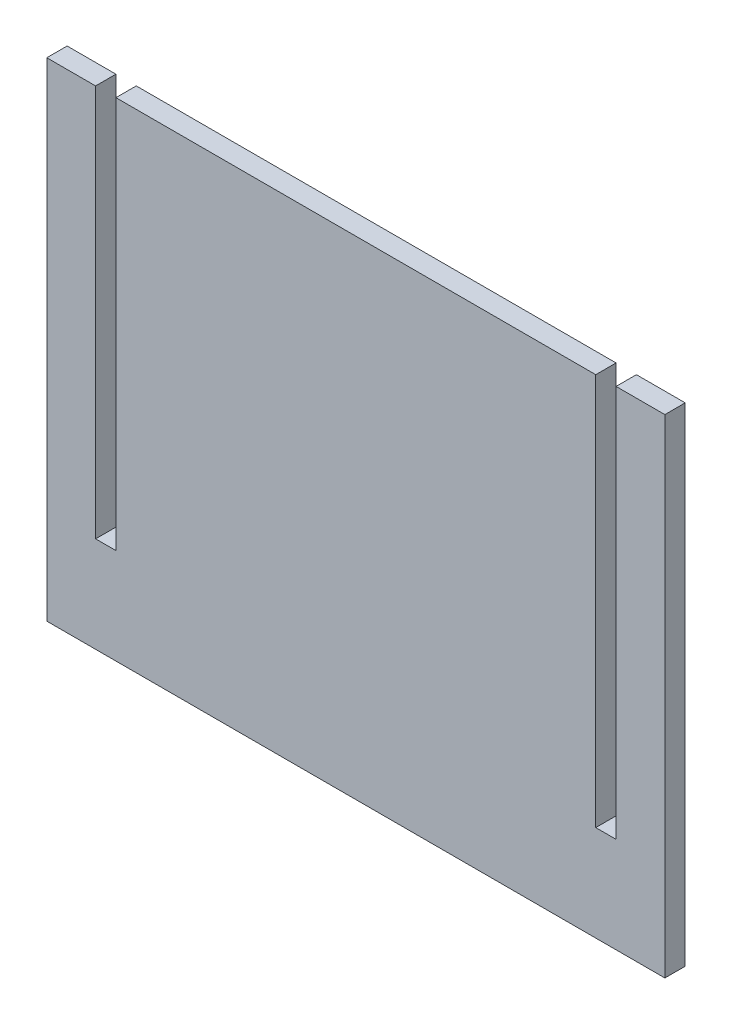
ISO-10303-21;
HEADER;
FILE_DESCRIPTION(('STEP AP214'),'2;1');
FILE_NAME('part.step','',(''),(''),'','','');
FILE_SCHEMA(('AUTOMOTIVE_DESIGN { 1 0 10303 214 1 1 1 1 }'));
ENDSEC;
DATA;
#1=APPLICATION_CONTEXT('core data for automotive mechanical design processes');
#2=APPLICATION_PROTOCOL_DEFINITION('international standard','automotive_design',2000,#1);
#3=PRODUCT_CONTEXT('',#1,'mechanical');
#4=PRODUCT('Part','Part','',(#3));
#5=PRODUCT_RELATED_PRODUCT_CATEGORY('part','',(#4));
#6=PRODUCT_DEFINITION_FORMATION('','',#4);
#7=PRODUCT_DEFINITION_CONTEXT('part definition',#1,'design');
#8=PRODUCT_DEFINITION('design','',#6,#7);
#9=PRODUCT_DEFINITION_SHAPE('','',#8);
#10=(LENGTH_UNIT() NAMED_UNIT(*) SI_UNIT(.MILLI.,.METRE.));
#11=(NAMED_UNIT(*) PLANE_ANGLE_UNIT() SI_UNIT($,.RADIAN.));
#12=(NAMED_UNIT(*) SI_UNIT($,.STERADIAN.) SOLID_ANGLE_UNIT());
#13=UNCERTAINTY_MEASURE_WITH_UNIT(LENGTH_MEASURE(1.E-05),#10,'distance_accuracy_value','');
#14=(GEOMETRIC_REPRESENTATION_CONTEXT(3) GLOBAL_UNCERTAINTY_ASSIGNED_CONTEXT((#13)) GLOBAL_UNIT_ASSIGNED_CONTEXT((#10,
#11,#12)) REPRESENTATION_CONTEXT('',''));
#15=CARTESIAN_POINT('',(0.,0.,0.));
#16=DIRECTION('',(0.,0.,1.));
#17=DIRECTION('',(1.,0.,0.));
#18=AXIS2_PLACEMENT_3D('',#15,#16,#17);
#19=CARTESIAN_POINT('',(0.,0.,3.175));
#20=DIRECTION('',(0.,1.,0.));
#21=DIRECTION('',(-1.,0.,0.));
#22=AXIS2_PLACEMENT_3D('',#19,#20,#21);
#23=PLANE('',#22);
#24=DIRECTION('',(1.,0.,0.));
#25=VECTOR('',#24,1.);
#26=CARTESIAN_POINT('',(0.,0.,0.));
#27=LINE('',#26,#25);
#28=CARTESIAN_POINT('',(0.,0.,0.));
#29=VERTEX_POINT('',#28);
#30=CARTESIAN_POINT('',(96.52,0.,0.));
#31=VERTEX_POINT('',#30);
#32=EDGE_CURVE('E209',#29,#31,#27,.T.);
#33=ORIENTED_EDGE('',*,*,#32,.T.);
#34=DIRECTION('',(0.,0.,-1.));
#35=VECTOR('',#34,1.);
#36=CARTESIAN_POINT('',(96.52,0.,3.175));
#37=LINE('',#36,#35);
#38=CARTESIAN_POINT('',(96.52,0.,3.175));
#39=VERTEX_POINT('',#38);
#40=EDGE_CURVE('E11',#39,#31,#37,.T.);
#41=ORIENTED_EDGE('',*,*,#40,.F.);
#42=DIRECTION('',(1.,0.,0.));
#43=VECTOR('',#42,1.);
#44=CARTESIAN_POINT('',(0.,0.,3.175));
#45=LINE('',#44,#43);
#46=CARTESIAN_POINT('',(0.,0.,3.175));
#47=VERTEX_POINT('',#46);
#48=EDGE_CURVE('E173',#47,#39,#45,.T.);
#49=ORIENTED_EDGE('',*,*,#48,.F.);
#50=DIRECTION('',(0.,0.,-1.));
#51=VECTOR('',#50,1.);
#52=CARTESIAN_POINT('',(0.,0.,3.175));
#53=LINE('',#52,#51);
#54=EDGE_CURVE('E51',#47,#29,#53,.T.);
#55=ORIENTED_EDGE('',*,*,#54,.T.);
#56=EDGE_LOOP('',(#33,#41,#49,#55));
#57=FACE_BOUND('',#56,.T.);
#58=ADVANCED_FACE('F35',(#57),#23,.F.);
#59=CARTESIAN_POINT('',(96.52,0.,3.175));
#60=DIRECTION('',(-1.,0.,0.));
#61=DIRECTION('',(0.,-1.,0.));
#62=AXIS2_PLACEMENT_3D('',#59,#60,#61);
#63=PLANE('',#62);
#64=DIRECTION('',(0.,1.,0.));
#65=VECTOR('',#64,1.);
#66=CARTESIAN_POINT('',(96.52,0.,0.));
#67=LINE('',#66,#65);
#68=CARTESIAN_POINT('',(96.52,76.2,0.));
#69=VERTEX_POINT('',#68);
#70=EDGE_CURVE('E207',#31,#69,#67,.T.);
#71=ORIENTED_EDGE('',*,*,#70,.T.);
#72=DIRECTION('',(0.,0.,-1.));
#73=VECTOR('',#72,1.);
#74=CARTESIAN_POINT('',(96.52,76.2,3.175));
#75=LINE('',#74,#73);
#76=CARTESIAN_POINT('',(96.52,76.2,3.175));
#77=VERTEX_POINT('',#76);
#78=EDGE_CURVE('E43',#77,#69,#75,.T.);
#79=ORIENTED_EDGE('',*,*,#78,.F.);
#80=DIRECTION('',(0.,1.,0.));
#81=VECTOR('',#80,1.);
#82=CARTESIAN_POINT('',(96.52,0.,3.175));
#83=LINE('',#82,#81);
#84=EDGE_CURVE('E101',#39,#77,#83,.T.);
#85=ORIENTED_EDGE('',*,*,#84,.F.);
#86=ORIENTED_EDGE('',*,*,#40,.T.);
#87=EDGE_LOOP('',(#71,#79,#85,#86));
#88=FACE_BOUND('',#87,.T.);
#89=ADVANCED_FACE('F208',(#88),#63,.F.);
#90=CARTESIAN_POINT('',(0.,76.2,3.175));
#91=DIRECTION('',(0.,1.,0.));
#92=DIRECTION('',(-1.,0.,0.));
#93=AXIS2_PLACEMENT_3D('',#90,#91,#92);
#94=PLANE('',#93);
#95=DIRECTION('',(1.,0.,0.));
#96=VECTOR('',#95,1.);
#97=CARTESIAN_POINT('',(0.,76.2,0.));
#98=LINE('',#97,#96);
#99=CARTESIAN_POINT('',(88.9,76.2,0.));
#100=VERTEX_POINT('',#99);
#101=EDGE_CURVE('E205',#100,#69,#98,.T.);
#102=ORIENTED_EDGE('',*,*,#101,.F.);
#103=DIRECTION('',(0.,0.,-1.));
#104=VECTOR('',#103,1.);
#105=CARTESIAN_POINT('',(88.9,76.2,3.175));
#106=LINE('',#105,#104);
#107=CARTESIAN_POINT('',(88.9,76.2,3.175));
#108=VERTEX_POINT('',#107);
#109=EDGE_CURVE('E199',#108,#100,#106,.T.);
#110=ORIENTED_EDGE('',*,*,#109,.F.);
#111=DIRECTION('',(1.,0.,0.));
#112=VECTOR('',#111,1.);
#113=CARTESIAN_POINT('',(0.,76.2,3.175));
#114=LINE('',#113,#112);
#115=EDGE_CURVE('E169',#108,#77,#114,.T.);
#116=ORIENTED_EDGE('',*,*,#115,.T.);
#117=ORIENTED_EDGE('',*,*,#78,.T.);
#118=EDGE_LOOP('',(#102,#110,#116,#117));
#119=FACE_BOUND('',#118,.T.);
#120=ADVANCED_FACE('F203',(#119),#94,.T.);
#121=CARTESIAN_POINT('',(88.9,0.,3.175));
#122=DIRECTION('',(1.,0.,0.));
#123=DIRECTION('',(0.,1.,0.));
#124=AXIS2_PLACEMENT_3D('',#121,#122,#123);
#125=PLANE('',#124);
#126=DIRECTION('',(0.,-1.,0.));
#127=VECTOR('',#126,1.);
#128=CARTESIAN_POINT('',(88.9,0.,0.));
#129=LINE('',#128,#127);
#130=CARTESIAN_POINT('',(88.9,14.9428058514673,0.));
#131=VERTEX_POINT('',#130);
#132=EDGE_CURVE('E214',#100,#131,#129,.T.);
#133=ORIENTED_EDGE('',*,*,#132,.T.);
#134=DIRECTION('',(0.,0.,-1.));
#135=VECTOR('',#134,1.);
#136=CARTESIAN_POINT('',(88.9,14.9428058514673,3.175));
#137=LINE('',#136,#135);
#138=CARTESIAN_POINT('',(88.9,14.9428058514673,3.175));
#139=VERTEX_POINT('',#138);
#140=EDGE_CURVE('E196',#139,#131,#137,.T.);
#141=ORIENTED_EDGE('',*,*,#140,.F.);
#142=DIRECTION('',(0.,-1.,0.));
#143=VECTOR('',#142,1.);
#144=CARTESIAN_POINT('',(88.9,0.,3.175));
#145=LINE('',#144,#143);
#146=EDGE_CURVE('E165',#108,#139,#145,.T.);
#147=ORIENTED_EDGE('',*,*,#146,.F.);
#148=ORIENTED_EDGE('',*,*,#109,.T.);
#149=EDGE_LOOP('',(#133,#141,#147,#148));
#150=FACE_BOUND('',#149,.T.);
#151=ADVANCED_FACE('F249',(#150),#125,.F.);
#152=CARTESIAN_POINT('',(0.,14.9428058514673,3.175));
#153=DIRECTION('',(0.,-1.,0.));
#154=DIRECTION('',(1.,0.,0.));
#155=AXIS2_PLACEMENT_3D('',#152,#153,#154);
#156=PLANE('',#155);
#157=DIRECTION('',(-1.,0.,0.));
#158=VECTOR('',#157,1.);
#159=CARTESIAN_POINT('',(0.,14.9428058514673,0.));
#160=LINE('',#159,#158);
#161=CARTESIAN_POINT('',(85.725,14.9428058514673,0.));
#162=VERTEX_POINT('',#161);
#163=EDGE_CURVE('E216',#131,#162,#160,.T.);
#164=ORIENTED_EDGE('',*,*,#163,.T.);
#165=DIRECTION('',(0.,0.,-1.));
#166=VECTOR('',#165,1.);
#167=CARTESIAN_POINT('',(85.725,14.9428058514673,3.175));
#168=LINE('',#167,#166);
#169=CARTESIAN_POINT('',(85.725,14.9428058514673,3.175));
#170=VERTEX_POINT('',#169);
#171=EDGE_CURVE('E194',#170,#162,#168,.T.);
#172=ORIENTED_EDGE('',*,*,#171,.F.);
#173=DIRECTION('',(-1.,0.,0.));
#174=VECTOR('',#173,1.);
#175=CARTESIAN_POINT('',(0.,14.9428058514673,3.175));
#176=LINE('',#175,#174);
#177=EDGE_CURVE('E162',#139,#170,#176,.T.);
#178=ORIENTED_EDGE('',*,*,#177,.F.);
#179=ORIENTED_EDGE('',*,*,#140,.T.);
#180=EDGE_LOOP('',(#164,#172,#178,#179));
#181=FACE_BOUND('',#180,.T.);
#182=ADVANCED_FACE('F245',(#181),#156,.F.);
#183=CARTESIAN_POINT('',(85.725,0.,3.175));
#184=DIRECTION('',(1.,0.,0.));
#185=DIRECTION('',(0.,1.,0.));
#186=AXIS2_PLACEMENT_3D('',#183,#184,#185);
#187=PLANE('',#186);
#188=DIRECTION('',(0.,-1.,0.));
#189=VECTOR('',#188,1.);
#190=CARTESIAN_POINT('',(85.725,0.,0.));
#191=LINE('',#190,#189);
#192=CARTESIAN_POINT('',(85.725,76.2,0.));
#193=VERTEX_POINT('',#192);
#194=EDGE_CURVE('E222',#193,#162,#191,.T.);
#195=ORIENTED_EDGE('',*,*,#194,.F.);
#196=DIRECTION('',(0.,0.,-1.));
#197=VECTOR('',#196,1.);
#198=CARTESIAN_POINT('',(85.725,76.2,3.175));
#199=LINE('',#198,#197);
#200=CARTESIAN_POINT('',(85.725,76.2,3.175));
#201=VERTEX_POINT('',#200);
#202=EDGE_CURVE('E192',#201,#193,#199,.T.);
#203=ORIENTED_EDGE('',*,*,#202,.F.);
#204=DIRECTION('',(0.,-1.,0.));
#205=VECTOR('',#204,1.);
#206=CARTESIAN_POINT('',(85.725,0.,3.175));
#207=LINE('',#206,#205);
#208=EDGE_CURVE('E158',#201,#170,#207,.T.);
#209=ORIENTED_EDGE('',*,*,#208,.T.);
#210=ORIENTED_EDGE('',*,*,#171,.T.);
#211=EDGE_LOOP('',(#195,#203,#209,#210));
#212=FACE_BOUND('',#211,.T.);
#213=ADVANCED_FACE('F241',(#212),#187,.T.);
#214=CARTESIAN_POINT('',(0.,76.2,3.175));
#215=DIRECTION('',(0.,1.,0.));
#216=DIRECTION('',(-1.,0.,0.));
#217=AXIS2_PLACEMENT_3D('',#214,#215,#216);
#218=PLANE('',#217);
#219=DIRECTION('',(1.,0.,0.));
#220=VECTOR('',#219,1.);
#221=CARTESIAN_POINT('',(0.,76.2,0.));
#222=LINE('',#221,#220);
#223=CARTESIAN_POINT('',(10.795,76.2,0.));
#224=VERTEX_POINT('',#223);
#225=EDGE_CURVE('E181',#224,#193,#222,.T.);
#226=ORIENTED_EDGE('',*,*,#225,.F.);
#227=DIRECTION('',(0.,0.,-1.));
#228=VECTOR('',#227,1.);
#229=CARTESIAN_POINT('',(10.795,76.2,3.175));
#230=LINE('',#229,#228);
#231=CARTESIAN_POINT('',(10.795,76.2,3.175));
#232=VERTEX_POINT('',#231);
#233=EDGE_CURVE('E190',#232,#224,#230,.T.);
#234=ORIENTED_EDGE('',*,*,#233,.F.);
#235=DIRECTION('',(1.,0.,0.));
#236=VECTOR('',#235,1.);
#237=CARTESIAN_POINT('',(0.,76.2,3.175));
#238=LINE('',#237,#236);
#239=EDGE_CURVE('E152',#232,#201,#238,.T.);
#240=ORIENTED_EDGE('',*,*,#239,.T.);
#241=ORIENTED_EDGE('',*,*,#202,.T.);
#242=EDGE_LOOP('',(#226,#234,#240,#241));
#243=FACE_BOUND('',#242,.T.);
#244=ADVANCED_FACE('F239',(#243),#218,.T.);
#245=CARTESIAN_POINT('',(10.795,0.,3.175));
#246=DIRECTION('',(1.,0.,0.));
#247=DIRECTION('',(0.,1.,0.));
#248=AXIS2_PLACEMENT_3D('',#245,#246,#247);
#249=PLANE('',#248);
#250=DIRECTION('',(0.,-1.,0.));
#251=VECTOR('',#250,1.);
#252=CARTESIAN_POINT('',(10.795,0.,0.));
#253=LINE('',#252,#251);
#254=CARTESIAN_POINT('',(10.795,14.9428058514673,0.));
#255=VERTEX_POINT('',#254);
#256=EDGE_CURVE('E226',#224,#255,#253,.T.);
#257=ORIENTED_EDGE('',*,*,#256,.T.);
#258=DIRECTION('',(0.,0.,-1.));
#259=VECTOR('',#258,1.);
#260=CARTESIAN_POINT('',(10.795,14.9428058514673,3.175));
#261=LINE('',#260,#259);
#262=CARTESIAN_POINT('',(10.795,14.9428058514673,3.175));
#263=VERTEX_POINT('',#262);
#264=EDGE_CURVE('E188',#263,#255,#261,.T.);
#265=ORIENTED_EDGE('',*,*,#264,.F.);
#266=DIRECTION('',(0.,-1.,0.));
#267=VECTOR('',#266,1.);
#268=CARTESIAN_POINT('',(10.795,0.,3.175));
#269=LINE('',#268,#267);
#270=EDGE_CURVE('E157',#232,#263,#269,.T.);
#271=ORIENTED_EDGE('',*,*,#270,.F.);
#272=ORIENTED_EDGE('',*,*,#233,.T.);
#273=EDGE_LOOP('',(#257,#265,#271,#272));
#274=FACE_BOUND('',#273,.T.);
#275=ADVANCED_FACE('F238',(#274),#249,.F.);
#276=CARTESIAN_POINT('',(0.,14.9428058514673,3.175));
#277=DIRECTION('',(0.,1.,0.));
#278=DIRECTION('',(0.,0.,1.));
#279=AXIS2_PLACEMENT_3D('',#276,#277,#278);
#280=PLANE('',#279);
#281=DIRECTION('',(1.,0.,0.));
#282=VECTOR('',#281,1.);
#283=CARTESIAN_POINT('',(0.,14.9428058514673,0.));
#284=LINE('',#283,#282);
#285=CARTESIAN_POINT('',(7.62000000000001,14.9428058514673,0.));
#286=VERTEX_POINT('',#285);
#287=EDGE_CURVE('E228',#286,#255,#284,.T.);
#288=ORIENTED_EDGE('',*,*,#287,.F.);
#289=DIRECTION('',(0.,0.,-1.));
#290=VECTOR('',#289,1.);
#291=CARTESIAN_POINT('',(7.62000000000001,14.9428058514673,3.175));
#292=LINE('',#291,#290);
#293=CARTESIAN_POINT('',(7.62000000000001,14.9428058514673,3.175));
#294=VERTEX_POINT('',#293);
#295=EDGE_CURVE('E138',#294,#286,#292,.T.);
#296=ORIENTED_EDGE('',*,*,#295,.F.);
#297=DIRECTION('',(1.,0.,0.));
#298=VECTOR('',#297,1.);
#299=CARTESIAN_POINT('',(0.,14.9428058514673,3.175));
#300=LINE('',#299,#298);
#301=EDGE_CURVE('E147',#294,#263,#300,.T.);
#302=ORIENTED_EDGE('',*,*,#301,.T.);
#303=ORIENTED_EDGE('',*,*,#264,.T.);
#304=EDGE_LOOP('',(#288,#296,#302,#303));
#305=FACE_BOUND('',#304,.T.);
#306=ADVANCED_FACE('F234',(#305),#280,.T.);
#307=CARTESIAN_POINT('',(7.62000000000001,0.,3.175));
#308=DIRECTION('',(1.,0.,0.));
#309=DIRECTION('',(0.,1.,0.));
#310=AXIS2_PLACEMENT_3D('',#307,#308,#309);
#311=PLANE('',#310);
#312=DIRECTION('',(0.,-1.,0.));
#313=VECTOR('',#312,1.);
#314=CARTESIAN_POINT('',(7.62000000000001,0.,0.));
#315=LINE('',#314,#313);
#316=CARTESIAN_POINT('',(7.62,76.2,0.));
#317=VERTEX_POINT('',#316);
#318=EDGE_CURVE('E134',#317,#286,#315,.T.);
#319=ORIENTED_EDGE('',*,*,#318,.F.);
#320=DIRECTION('',(0.,0.,-1.));
#321=VECTOR('',#320,1.);
#322=CARTESIAN_POINT('',(7.62,76.2,3.175));
#323=LINE('',#322,#321);
#324=CARTESIAN_POINT('',(7.62,76.2,3.175));
#325=VERTEX_POINT('',#324);
#326=EDGE_CURVE('E129',#325,#317,#323,.T.);
#327=ORIENTED_EDGE('',*,*,#326,.F.);
#328=DIRECTION('',(0.,-1.,0.));
#329=VECTOR('',#328,1.);
#330=CARTESIAN_POINT('',(7.62000000000001,0.,3.175));
#331=LINE('',#330,#329);
#332=EDGE_CURVE('E132',#325,#294,#331,.T.);
#333=ORIENTED_EDGE('',*,*,#332,.T.);
#334=ORIENTED_EDGE('',*,*,#295,.T.);
#335=EDGE_LOOP('',(#319,#327,#333,#334));
#336=FACE_BOUND('',#335,.T.);
#337=ADVANCED_FACE('F131',(#336),#311,.T.);
#338=CARTESIAN_POINT('',(0.,76.2,0.));
#339=VERTEX_POINT('',#338);
#340=EDGE_CURVE('E177',#339,#317,#222,.T.);
#341=ORIENTED_EDGE('',*,*,#340,.F.);
#342=DIRECTION('',(0.,0.,-1.));
#343=VECTOR('',#342,1.);
#344=CARTESIAN_POINT('',(0.,76.2,3.175));
#345=LINE('',#344,#343);
#346=CARTESIAN_POINT('',(0.,76.2,3.175));
#347=VERTEX_POINT('',#346);
#348=EDGE_CURVE('E89',#347,#339,#345,.T.);
#349=ORIENTED_EDGE('',*,*,#348,.F.);
#350=EDGE_CURVE('E145',#347,#325,#238,.T.);
#351=ORIENTED_EDGE('',*,*,#350,.T.);
#352=ORIENTED_EDGE('',*,*,#326,.T.);
#353=EDGE_LOOP('',(#341,#349,#351,#352));
#354=FACE_BOUND('',#353,.T.);
#355=ADVANCED_FACE('F149',(#354),#218,.T.);
#356=CARTESIAN_POINT('',(0.,0.,3.175));
#357=DIRECTION('',(-1.,0.,0.));
#358=DIRECTION('',(0.,0.,1.));
#359=AXIS2_PLACEMENT_3D('',#356,#357,#358);
#360=PLANE('',#359);
#361=DIRECTION('',(0.,1.,0.));
#362=VECTOR('',#361,1.);
#363=CARTESIAN_POINT('',(0.,0.,0.));
#364=LINE('',#363,#362);
#365=EDGE_CURVE('E174',#29,#339,#364,.T.);
#366=ORIENTED_EDGE('',*,*,#365,.F.);
#367=ORIENTED_EDGE('',*,*,#54,.F.);
#368=DIRECTION('',(0.,1.,0.));
#369=VECTOR('',#368,1.);
#370=CARTESIAN_POINT('',(0.,0.,3.175));
#371=LINE('',#370,#369);
#372=EDGE_CURVE('E150',#47,#347,#371,.T.);
#373=ORIENTED_EDGE('',*,*,#372,.T.);
#374=ORIENTED_EDGE('',*,*,#348,.T.);
#375=EDGE_LOOP('',(#366,#367,#373,#374));
#376=FACE_BOUND('',#375,.T.);
#377=ADVANCED_FACE('F263',(#376),#360,.T.);
#378=CARTESIAN_POINT('',(0.,0.,3.175));
#379=DIRECTION('',(0.,0.,1.));
#380=DIRECTION('',(1.,0.,0.));
#381=AXIS2_PLACEMENT_3D('',#378,#379,#380);
#382=PLANE('',#381);
#383=ORIENTED_EDGE('',*,*,#48,.T.);
#384=ORIENTED_EDGE('',*,*,#84,.T.);
#385=ORIENTED_EDGE('',*,*,#115,.F.);
#386=ORIENTED_EDGE('',*,*,#146,.T.);
#387=ORIENTED_EDGE('',*,*,#177,.T.);
#388=ORIENTED_EDGE('',*,*,#208,.F.);
#389=ORIENTED_EDGE('',*,*,#239,.F.);
#390=ORIENTED_EDGE('',*,*,#270,.T.);
#391=ORIENTED_EDGE('',*,*,#301,.F.);
#392=ORIENTED_EDGE('',*,*,#332,.F.);
#393=ORIENTED_EDGE('',*,*,#350,.F.);
#394=ORIENTED_EDGE('',*,*,#372,.F.);
#395=EDGE_LOOP('',(#383,#384,#385,#386,#387,#388,#389,#390,#391,#392,#393,#394));
#396=FACE_BOUND('',#395,.T.);
#397=ADVANCED_FACE('F143',(#396),#382,.T.);
#398=CARTESIAN_POINT('',(0.,0.,0.));
#399=DIRECTION('',(0.,0.,1.));
#400=DIRECTION('',(1.,0.,0.));
#401=AXIS2_PLACEMENT_3D('',#398,#399,#400);
#402=PLANE('',#401);
#403=ORIENTED_EDGE('',*,*,#32,.F.);
#404=ORIENTED_EDGE('',*,*,#365,.T.);
#405=ORIENTED_EDGE('',*,*,#340,.T.);
#406=ORIENTED_EDGE('',*,*,#318,.T.);
#407=ORIENTED_EDGE('',*,*,#287,.T.);
#408=ORIENTED_EDGE('',*,*,#256,.F.);
#409=ORIENTED_EDGE('',*,*,#225,.T.);
#410=ORIENTED_EDGE('',*,*,#194,.T.);
#411=ORIENTED_EDGE('',*,*,#163,.F.);
#412=ORIENTED_EDGE('',*,*,#132,.F.);
#413=ORIENTED_EDGE('',*,*,#101,.T.);
#414=ORIENTED_EDGE('',*,*,#70,.F.);
#415=EDGE_LOOP('',(#403,#404,#405,#406,#407,#408,#409,#410,#411,#412,#413,#414));
#416=FACE_BOUND('',#415,.T.);
#417=ADVANCED_FACE('F212',(#416),#402,.F.);
#418=CLOSED_SHELL('',(#58,#89,#120,#151,#182,#213,#244,#275,#306,#337,#355,#377,#397,#417));
#419=MANIFOLD_SOLID_BREP('B2',#418);
#420=ADVANCED_BREP_SHAPE_REPRESENTATION('',(#18,#419),#14);
#421=SHAPE_DEFINITION_REPRESENTATION(#9,#420);
ENDSEC;
END-ISO-10303-21;
